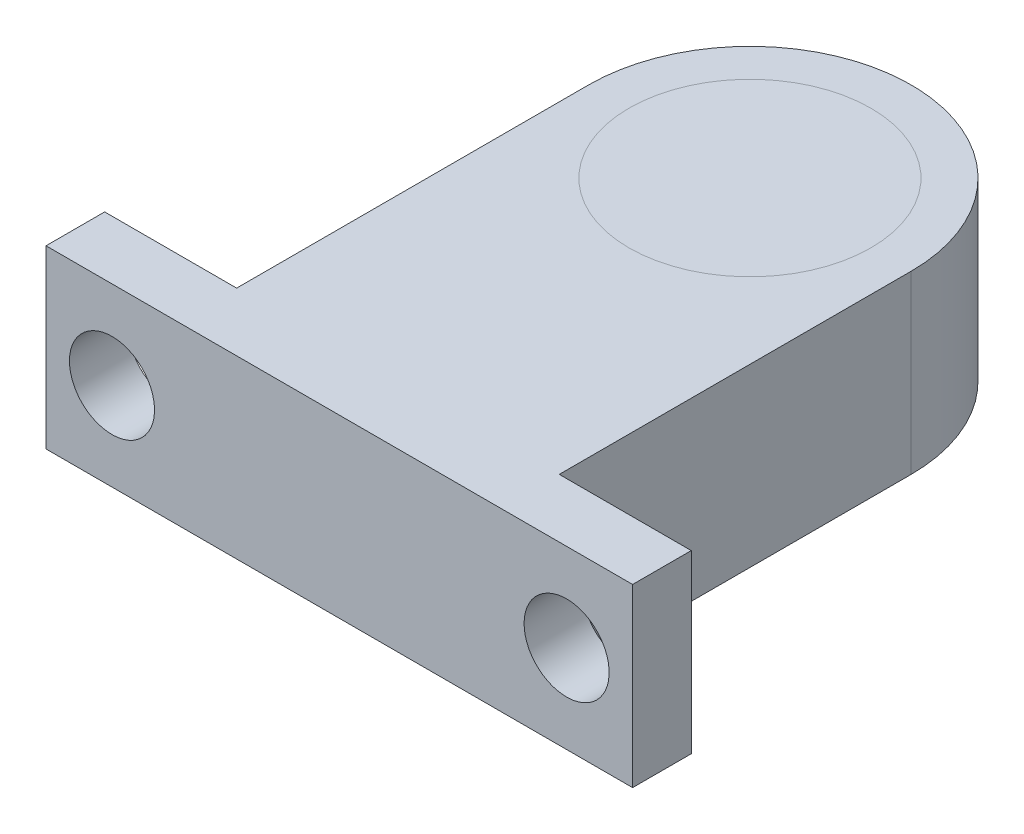
ISO-10303-21;
HEADER;
FILE_DESCRIPTION(('STEP AP214'),'2;1');
FILE_NAME('part.step','',(''),(''),'','','');
FILE_SCHEMA(('AUTOMOTIVE_DESIGN { 1 0 10303 214 1 1 1 1 }'));
ENDSEC;
DATA;
#1=APPLICATION_CONTEXT('core data for automotive mechanical design processes');
#2=APPLICATION_PROTOCOL_DEFINITION('international standard','automotive_design',2000,#1);
#3=PRODUCT_CONTEXT('',#1,'mechanical');
#4=PRODUCT('Part','Part','',(#3));
#5=PRODUCT_RELATED_PRODUCT_CATEGORY('part','',(#4));
#6=PRODUCT_DEFINITION_FORMATION('','',#4);
#7=PRODUCT_DEFINITION_CONTEXT('part definition',#1,'design');
#8=PRODUCT_DEFINITION('design','',#6,#7);
#9=PRODUCT_DEFINITION_SHAPE('','',#8);
#10=(LENGTH_UNIT() NAMED_UNIT(*) SI_UNIT(.MILLI.,.METRE.));
#11=(NAMED_UNIT(*) PLANE_ANGLE_UNIT() SI_UNIT($,.RADIAN.));
#12=(NAMED_UNIT(*) SI_UNIT($,.STERADIAN.) SOLID_ANGLE_UNIT());
#13=UNCERTAINTY_MEASURE_WITH_UNIT(LENGTH_MEASURE(1.E-05),#10,'distance_accuracy_value','');
#14=(GEOMETRIC_REPRESENTATION_CONTEXT(3) GLOBAL_UNCERTAINTY_ASSIGNED_CONTEXT((#13)) GLOBAL_UNIT_ASSIGNED_CONTEXT((#10,
#11,#12)) REPRESENTATION_CONTEXT('',''));
#15=CARTESIAN_POINT('',(0.,0.,0.));
#16=DIRECTION('',(0.,0.,1.));
#17=DIRECTION('',(1.,0.,0.));
#18=AXIS2_PLACEMENT_3D('',#15,#16,#17);
#19=CARTESIAN_POINT('',(0.,5.5,0.));
#20=DIRECTION('',(0.,1.,0.));
#21=DIRECTION('',(0.,0.,1.));
#22=AXIS2_PLACEMENT_3D('',#19,#20,#21);
#23=CYLINDRICAL_SURFACE('',#22,4.12499999999999);
#24=CARTESIAN_POINT('',(0.,5.5,0.));
#25=DIRECTION('',(0.,1.,0.));
#26=DIRECTION('',(0.,0.,1.));
#27=AXIS2_PLACEMENT_3D('',#24,#25,#26);
#28=CIRCLE('',#27,4.12499999999999);
#29=CARTESIAN_POINT('',(0.,5.5,4.12499999999999));
#30=VERTEX_POINT('',#29);
#31=EDGE_CURVE('E11',#30,#30,#28,.T.);
#32=ORIENTED_EDGE('',*,*,#31,.T.);
#33=EDGE_LOOP('',(#32));
#34=FACE_BOUND('',#33,.T.);
#35=CARTESIAN_POINT('',(0.,6.,0.));
#36=DIRECTION('',(0.,1.,0.));
#37=DIRECTION('',(0.,0.,1.));
#38=AXIS2_PLACEMENT_3D('',#35,#36,#37);
#39=CIRCLE('',#38,4.12499999999999);
#40=CARTESIAN_POINT('',(0.,6.,4.12499999999999));
#41=VERTEX_POINT('',#40);
#42=EDGE_CURVE('E58',#41,#41,#39,.T.);
#43=ORIENTED_EDGE('',*,*,#42,.F.);
#44=EDGE_LOOP('',(#43));
#45=FACE_BOUND('',#44,.T.);
#46=ADVANCED_FACE('F55',(#34,#45),#23,.T.);
#47=CARTESIAN_POINT('',(0.,5.5,0.));
#48=DIRECTION('',(0.,1.,0.));
#49=DIRECTION('',(0.,0.,1.));
#50=AXIS2_PLACEMENT_3D('',#47,#48,#49);
#51=PLANE('',#50);
#52=ORIENTED_EDGE('',*,*,#31,.F.);
#53=EDGE_LOOP('',(#52));
#54=FACE_BOUND('',#53,.T.);
#55=ADVANCED_FACE('F70',(#54),#51,.F.);
#56=CARTESIAN_POINT('',(0.,6.,0.));
#57=DIRECTION('',(0.,1.,0.));
#58=DIRECTION('',(0.,0.,1.));
#59=AXIS2_PLACEMENT_3D('',#56,#57,#58);
#60=PLANE('',#59);
#61=ORIENTED_EDGE('',*,*,#42,.T.);
#62=EDGE_LOOP('',(#61));
#63=FACE_BOUND('',#62,.T.);
#64=ADVANCED_FACE('F67',(#63),#60,.T.);
#65=CLOSED_SHELL('',(#46,#55,#64));
#66=MANIFOLD_SOLID_BREP('B2',#65);
#67=CARTESIAN_POINT('',(5.5,6.,0.));
#68=DIRECTION('',(1.,0.,0.));
#69=DIRECTION('',(0.,0.,-1.));
#70=AXIS2_PLACEMENT_3D('',#67,#68,#69);
#71=PLANE('',#70);
#72=DIRECTION('',(0.,0.,1.));
#73=VECTOR('',#72,1.);
#74=CARTESIAN_POINT('',(5.5,0.,0.));
#75=LINE('',#74,#73);
#76=CARTESIAN_POINT('',(5.5,0.,0.));
#77=VERTEX_POINT('',#76);
#78=CARTESIAN_POINT('',(5.5,0.,12.));
#79=VERTEX_POINT('',#78);
#80=EDGE_CURVE('E198',#77,#79,#75,.T.);
#81=ORIENTED_EDGE('',*,*,#80,.F.);
#82=DIRECTION('',(0.,-1.,0.));
#83=VECTOR('',#82,1.);
#84=CARTESIAN_POINT('',(5.5,6.,0.));
#85=LINE('',#84,#83);
#86=CARTESIAN_POINT('',(5.5,6.,0.));
#87=VERTEX_POINT('',#86);
#88=EDGE_CURVE('E53',#87,#77,#85,.T.);
#89=ORIENTED_EDGE('',*,*,#88,.F.);
#90=DIRECTION('',(0.,0.,1.));
#91=VECTOR('',#90,1.);
#92=CARTESIAN_POINT('',(5.5,6.,0.));
#93=LINE('',#92,#91);
#94=CARTESIAN_POINT('',(5.5,6.,12.));
#95=VERTEX_POINT('',#94);
#96=EDGE_CURVE('E114',#87,#95,#93,.T.);
#97=ORIENTED_EDGE('',*,*,#96,.T.);
#98=DIRECTION('',(0.,-1.,0.));
#99=VECTOR('',#98,1.);
#100=CARTESIAN_POINT('',(5.5,6.,12.));
#101=LINE('',#100,#99);
#102=EDGE_CURVE('E133',#95,#79,#101,.T.);
#103=ORIENTED_EDGE('',*,*,#102,.T.);
#104=EDGE_LOOP('',(#81,#89,#97,#103));
#105=FACE_BOUND('',#104,.T.);
#106=ADVANCED_FACE('F96',(#105),#71,.T.);
#107=CARTESIAN_POINT('',(0.,6.,0.));
#108=DIRECTION('',(0.,-1.,0.));
#109=DIRECTION('',(0.,0.,-1.));
#110=AXIS2_PLACEMENT_3D('',#107,#108,#109);
#111=CYLINDRICAL_SURFACE('',#110,5.5);
#112=CARTESIAN_POINT('',(0.,0.,0.));
#113=DIRECTION('',(0.,1.,0.));
#114=DIRECTION('',(0.,0.,1.));
#115=AXIS2_PLACEMENT_3D('',#112,#113,#114);
#116=CIRCLE('',#115,5.5);
#117=CARTESIAN_POINT('',(-5.5,0.,0.));
#118=VERTEX_POINT('',#117);
#119=EDGE_CURVE('E219',#77,#118,#116,.T.);
#120=ORIENTED_EDGE('',*,*,#119,.T.);
#121=DIRECTION('',(0.,-1.,0.));
#122=VECTOR('',#121,1.);
#123=CARTESIAN_POINT('',(-5.5,6.,0.));
#124=LINE('',#123,#122);
#125=CARTESIAN_POINT('',(-5.5,6.,0.));
#126=VERTEX_POINT('',#125);
#127=EDGE_CURVE('E106',#126,#118,#124,.T.);
#128=ORIENTED_EDGE('',*,*,#127,.F.);
#129=CARTESIAN_POINT('',(0.,6.,0.));
#130=DIRECTION('',(0.,1.,0.));
#131=DIRECTION('',(0.,0.,1.));
#132=AXIS2_PLACEMENT_3D('',#129,#130,#131);
#133=CIRCLE('',#132,5.5);
#134=EDGE_CURVE('E210',#87,#126,#133,.T.);
#135=ORIENTED_EDGE('',*,*,#134,.F.);
#136=ORIENTED_EDGE('',*,*,#88,.T.);
#137=EDGE_LOOP('',(#120,#128,#135,#136));
#138=FACE_BOUND('',#137,.T.);
#139=ADVANCED_FACE('F236',(#138),#111,.T.);
#140=CARTESIAN_POINT('',(-5.5,6.,0.));
#141=DIRECTION('',(1.,0.,0.));
#142=DIRECTION('',(0.,0.,-1.));
#143=AXIS2_PLACEMENT_3D('',#140,#141,#142);
#144=PLANE('',#143);
#145=DIRECTION('',(0.,0.,1.));
#146=VECTOR('',#145,1.);
#147=CARTESIAN_POINT('',(-5.5,0.,0.));
#148=LINE('',#147,#146);
#149=CARTESIAN_POINT('',(-5.5,0.,12.));
#150=VERTEX_POINT('',#149);
#151=EDGE_CURVE('E129',#118,#150,#148,.T.);
#152=ORIENTED_EDGE('',*,*,#151,.T.);
#153=DIRECTION('',(0.,-1.,0.));
#154=VECTOR('',#153,1.);
#155=CARTESIAN_POINT('',(-5.5,6.,12.));
#156=LINE('',#155,#154);
#157=CARTESIAN_POINT('',(-5.5,6.,12.));
#158=VERTEX_POINT('',#157);
#159=EDGE_CURVE('E227',#158,#150,#156,.T.);
#160=ORIENTED_EDGE('',*,*,#159,.F.);
#161=DIRECTION('',(0.,0.,1.));
#162=VECTOR('',#161,1.);
#163=CARTESIAN_POINT('',(-5.5,6.,0.));
#164=LINE('',#163,#162);
#165=EDGE_CURVE('E214',#126,#158,#164,.T.);
#166=ORIENTED_EDGE('',*,*,#165,.F.);
#167=ORIENTED_EDGE('',*,*,#127,.T.);
#168=EDGE_LOOP('',(#152,#160,#166,#167));
#169=FACE_BOUND('',#168,.T.);
#170=ADVANCED_FACE('F233',(#169),#144,.F.);
#171=CARTESIAN_POINT('',(0.,6.,0.));
#172=DIRECTION('',(0.,-1.,0.));
#173=DIRECTION('',(0.,0.,-1.));
#174=AXIS2_PLACEMENT_3D('',#171,#172,#173);
#175=CYLINDRICAL_SURFACE('',#174,4.12499999999999);
#176=CARTESIAN_POINT('',(0.,6.,0.));
#177=DIRECTION('',(0.,1.,0.));
#178=DIRECTION('',(0.,0.,1.));
#179=AXIS2_PLACEMENT_3D('',#176,#177,#178);
#180=CIRCLE('',#179,4.12499999999999);
#181=CARTESIAN_POINT('',(0.,6.,4.12499999999999));
#182=VERTEX_POINT('',#181);
#183=EDGE_CURVE('E204',#182,#182,#180,.T.);
#184=ORIENTED_EDGE('',*,*,#183,.T.);
#185=EDGE_LOOP('',(#184));
#186=FACE_BOUND('',#185,.T.);
#187=CARTESIAN_POINT('',(0.,0.,0.));
#188=DIRECTION('',(0.,1.,0.));
#189=DIRECTION('',(0.,0.,1.));
#190=AXIS2_PLACEMENT_3D('',#187,#188,#189);
#191=CIRCLE('',#190,4.12499999999999);
#192=CARTESIAN_POINT('',(0.,0.,4.12499999999999));
#193=VERTEX_POINT('',#192);
#194=EDGE_CURVE('E193',#193,#193,#191,.T.);
#195=ORIENTED_EDGE('',*,*,#194,.F.);
#196=EDGE_LOOP('',(#195));
#197=FACE_BOUND('',#196,.T.);
#198=ADVANCED_FACE('F98',(#186,#197),#175,.F.);
#199=CARTESIAN_POINT('',(0.,6.,0.));
#200=DIRECTION('',(0.,1.,0.));
#201=DIRECTION('',(0.,0.,1.));
#202=AXIS2_PLACEMENT_3D('',#199,#200,#201);
#203=PLANE('',#202);
#204=ORIENTED_EDGE('',*,*,#183,.F.);
#205=EDGE_LOOP('',(#204));
#206=FACE_BOUND('',#205,.T.);
#207=ORIENTED_EDGE('',*,*,#96,.F.);
#208=ORIENTED_EDGE('',*,*,#134,.T.);
#209=ORIENTED_EDGE('',*,*,#165,.T.);
#210=DIRECTION('',(-1.,0.,0.));
#211=VECTOR('',#210,1.);
#212=CARTESIAN_POINT('',(-10.,6.,12.));
#213=LINE('',#212,#211);
#214=CARTESIAN_POINT('',(-10.,6.,12.));
#215=VERTEX_POINT('',#214);
#216=EDGE_CURVE('E311',#158,#215,#213,.T.);
#217=ORIENTED_EDGE('',*,*,#216,.T.);
#218=DIRECTION('',(0.,0.,-1.));
#219=VECTOR('',#218,1.);
#220=CARTESIAN_POINT('',(-10.,6.,14.));
#221=LINE('',#220,#219);
#222=CARTESIAN_POINT('',(-10.,6.,14.));
#223=VERTEX_POINT('',#222);
#224=EDGE_CURVE('E301',#223,#215,#221,.T.);
#225=ORIENTED_EDGE('',*,*,#224,.F.);
#226=DIRECTION('',(-1.,0.,0.));
#227=VECTOR('',#226,1.);
#228=CARTESIAN_POINT('',(-10.,6.,14.));
#229=LINE('',#228,#227);
#230=CARTESIAN_POINT('',(10.,6.,14.));
#231=VERTEX_POINT('',#230);
#232=EDGE_CURVE('E182',#231,#223,#229,.T.);
#233=ORIENTED_EDGE('',*,*,#232,.F.);
#234=DIRECTION('',(0.,0.,-1.));
#235=VECTOR('',#234,1.);
#236=CARTESIAN_POINT('',(10.,6.,14.));
#237=LINE('',#236,#235);
#238=CARTESIAN_POINT('',(10.,6.,12.));
#239=VERTEX_POINT('',#238);
#240=EDGE_CURVE('E200',#231,#239,#237,.T.);
#241=ORIENTED_EDGE('',*,*,#240,.T.);
#242=EDGE_CURVE('E187',#239,#95,#213,.T.);
#243=ORIENTED_EDGE('',*,*,#242,.T.);
#244=EDGE_LOOP('',(#207,#208,#209,#217,#225,#233,#241,#243));
#245=FACE_BOUND('',#244,.T.);
#246=ADVANCED_FACE('F250',(#206,#245),#203,.T.);
#247=CARTESIAN_POINT('',(0.,0.,0.));
#248=DIRECTION('',(0.,1.,0.));
#249=DIRECTION('',(0.,0.,1.));
#250=AXIS2_PLACEMENT_3D('',#247,#248,#249);
#251=PLANE('',#250);
#252=ORIENTED_EDGE('',*,*,#194,.T.);
#253=EDGE_LOOP('',(#252));
#254=FACE_BOUND('',#253,.T.);
#255=ORIENTED_EDGE('',*,*,#80,.T.);
#256=DIRECTION('',(1.,0.,0.));
#257=VECTOR('',#256,1.);
#258=CARTESIAN_POINT('',(-10.,0.,12.));
#259=LINE('',#258,#257);
#260=CARTESIAN_POINT('',(10.,0.,12.));
#261=VERTEX_POINT('',#260);
#262=EDGE_CURVE('E304',#79,#261,#259,.T.);
#263=ORIENTED_EDGE('',*,*,#262,.T.);
#264=DIRECTION('',(0.,0.,-1.));
#265=VECTOR('',#264,1.);
#266=CARTESIAN_POINT('',(10.,0.,14.));
#267=LINE('',#266,#265);
#268=CARTESIAN_POINT('',(10.,0.,14.));
#269=VERTEX_POINT('',#268);
#270=EDGE_CURVE('E172',#269,#261,#267,.T.);
#271=ORIENTED_EDGE('',*,*,#270,.F.);
#272=DIRECTION('',(1.,0.,0.));
#273=VECTOR('',#272,1.);
#274=CARTESIAN_POINT('',(-10.,0.,14.));
#275=LINE('',#274,#273);
#276=CARTESIAN_POINT('',(-10.,0.,14.));
#277=VERTEX_POINT('',#276);
#278=EDGE_CURVE('E165',#277,#269,#275,.T.);
#279=ORIENTED_EDGE('',*,*,#278,.F.);
#280=DIRECTION('',(0.,0.,-1.));
#281=VECTOR('',#280,1.);
#282=CARTESIAN_POINT('',(-10.,0.,14.));
#283=LINE('',#282,#281);
#284=CARTESIAN_POINT('',(-10.,0.,12.));
#285=VERTEX_POINT('',#284);
#286=EDGE_CURVE('E169',#277,#285,#283,.T.);
#287=ORIENTED_EDGE('',*,*,#286,.T.);
#288=EDGE_CURVE('E305',#285,#150,#259,.T.);
#289=ORIENTED_EDGE('',*,*,#288,.T.);
#290=ORIENTED_EDGE('',*,*,#151,.F.);
#291=ORIENTED_EDGE('',*,*,#119,.F.);
#292=EDGE_LOOP('',(#255,#263,#271,#279,#287,#289,#290,#291));
#293=FACE_BOUND('',#292,.T.);
#294=ADVANCED_FACE('F167',(#254,#293),#251,.F.);
#295=CARTESIAN_POINT('',(0.,0.,12.));
#296=DIRECTION('',(0.,0.,1.));
#297=DIRECTION('',(1.,0.,0.));
#298=AXIS2_PLACEMENT_3D('',#295,#296,#297);
#299=PLANE('',#298);
#300=CARTESIAN_POINT('',(-7.75,3.,12.));
#301=DIRECTION('',(0.,0.,-1.));
#302=DIRECTION('',(-1.,0.,0.));
#303=AXIS2_PLACEMENT_3D('',#300,#301,#302);
#304=CIRCLE('',#303,1.45);
#305=CARTESIAN_POINT('',(-9.2,3.,12.));
#306=VERTEX_POINT('',#305);
#307=EDGE_CURVE('E287',#306,#306,#304,.T.);
#308=ORIENTED_EDGE('',*,*,#307,.F.);
#309=EDGE_LOOP('',(#308));
#310=FACE_BOUND('',#309,.T.);
#311=ORIENTED_EDGE('',*,*,#216,.F.);
#312=ORIENTED_EDGE('',*,*,#159,.T.);
#313=ORIENTED_EDGE('',*,*,#288,.F.);
#314=DIRECTION('',(0.,-1.,0.));
#315=VECTOR('',#314,1.);
#316=CARTESIAN_POINT('',(-10.,6.,12.));
#317=LINE('',#316,#315);
#318=EDGE_CURVE('E191',#215,#285,#317,.T.);
#319=ORIENTED_EDGE('',*,*,#318,.F.);
#320=EDGE_LOOP('',(#311,#312,#313,#319));
#321=FACE_BOUND('',#320,.T.);
#322=ADVANCED_FACE('F249',(#310,#321),#299,.F.);
#323=CARTESIAN_POINT('',(-10.,6.,14.));
#324=DIRECTION('',(1.,0.,0.));
#325=DIRECTION('',(0.,0.,-1.));
#326=AXIS2_PLACEMENT_3D('',#323,#324,#325);
#327=PLANE('',#326);
#328=ORIENTED_EDGE('',*,*,#318,.T.);
#329=ORIENTED_EDGE('',*,*,#286,.F.);
#330=DIRECTION('',(0.,-1.,0.));
#331=VECTOR('',#330,1.);
#332=CARTESIAN_POINT('',(-10.,6.,14.));
#333=LINE('',#332,#331);
#334=EDGE_CURVE('E177',#223,#277,#333,.T.);
#335=ORIENTED_EDGE('',*,*,#334,.F.);
#336=ORIENTED_EDGE('',*,*,#224,.T.);
#337=EDGE_LOOP('',(#328,#329,#335,#336));
#338=FACE_BOUND('',#337,.T.);
#339=ADVANCED_FACE('F189',(#338),#327,.F.);
#340=CARTESIAN_POINT('',(10.,6.,14.));
#341=DIRECTION('',(-1.,0.,0.));
#342=DIRECTION('',(0.,0.,1.));
#343=AXIS2_PLACEMENT_3D('',#340,#341,#342);
#344=PLANE('',#343);
#345=DIRECTION('',(0.,1.,0.));
#346=VECTOR('',#345,1.);
#347=CARTESIAN_POINT('',(10.,6.,12.));
#348=LINE('',#347,#346);
#349=EDGE_CURVE('E308',#261,#239,#348,.T.);
#350=ORIENTED_EDGE('',*,*,#349,.T.);
#351=ORIENTED_EDGE('',*,*,#240,.F.);
#352=DIRECTION('',(0.,1.,0.));
#353=VECTOR('',#352,1.);
#354=CARTESIAN_POINT('',(10.,6.,14.));
#355=LINE('',#354,#353);
#356=EDGE_CURVE('E176',#269,#231,#355,.T.);
#357=ORIENTED_EDGE('',*,*,#356,.F.);
#358=ORIENTED_EDGE('',*,*,#270,.T.);
#359=EDGE_LOOP('',(#350,#351,#357,#358));
#360=FACE_BOUND('',#359,.T.);
#361=ADVANCED_FACE('F257',(#360),#344,.F.);
#362=CARTESIAN_POINT('',(0.,0.,14.));
#363=DIRECTION('',(0.,0.,1.));
#364=DIRECTION('',(1.,0.,0.));
#365=AXIS2_PLACEMENT_3D('',#362,#363,#364);
#366=PLANE('',#365);
#367=CARTESIAN_POINT('',(7.75,3.,14.));
#368=DIRECTION('',(0.,0.,-1.));
#369=DIRECTION('',(-1.,0.,0.));
#370=AXIS2_PLACEMENT_3D('',#367,#368,#369);
#371=CIRCLE('',#370,1.45);
#372=CARTESIAN_POINT('',(6.3,3.,14.));
#373=VERTEX_POINT('',#372);
#374=EDGE_CURVE('E280',#373,#373,#371,.T.);
#375=ORIENTED_EDGE('',*,*,#374,.T.);
#376=EDGE_LOOP('',(#375));
#377=FACE_BOUND('',#376,.T.);
#378=CARTESIAN_POINT('',(-7.75,3.,14.));
#379=DIRECTION('',(0.,0.,-1.));
#380=DIRECTION('',(-1.,0.,0.));
#381=AXIS2_PLACEMENT_3D('',#378,#379,#380);
#382=CIRCLE('',#381,1.45);
#383=CARTESIAN_POINT('',(-9.2,3.,14.));
#384=VERTEX_POINT('',#383);
#385=EDGE_CURVE('E293',#384,#384,#382,.T.);
#386=ORIENTED_EDGE('',*,*,#385,.T.);
#387=EDGE_LOOP('',(#386));
#388=FACE_BOUND('',#387,.T.);
#389=ORIENTED_EDGE('',*,*,#334,.T.);
#390=ORIENTED_EDGE('',*,*,#278,.T.);
#391=ORIENTED_EDGE('',*,*,#356,.T.);
#392=ORIENTED_EDGE('',*,*,#232,.T.);
#393=EDGE_LOOP('',(#389,#390,#391,#392));
#394=FACE_BOUND('',#393,.T.);
#395=ADVANCED_FACE('F180',(#377,#388,#394),#366,.T.);
#396=CARTESIAN_POINT('',(7.75,3.,12.));
#397=DIRECTION('',(0.,0.,-1.));
#398=DIRECTION('',(-1.,0.,0.));
#399=AXIS2_PLACEMENT_3D('',#396,#397,#398);
#400=CIRCLE('',#399,1.45);
#401=CARTESIAN_POINT('',(6.3,3.,12.));
#402=VERTEX_POINT('',#401);
#403=EDGE_CURVE('E283',#402,#402,#400,.T.);
#404=ORIENTED_EDGE('',*,*,#403,.F.);
#405=EDGE_LOOP('',(#404));
#406=FACE_BOUND('',#405,.T.);
#407=ORIENTED_EDGE('',*,*,#102,.F.);
#408=ORIENTED_EDGE('',*,*,#242,.F.);
#409=ORIENTED_EDGE('',*,*,#349,.F.);
#410=ORIENTED_EDGE('',*,*,#262,.F.);
#411=EDGE_LOOP('',(#407,#408,#409,#410));
#412=FACE_BOUND('',#411,.T.);
#413=ADVANCED_FACE('F261',(#406,#412),#299,.F.);
#414=CARTESIAN_POINT('',(-7.75,3.,12.));
#415=DIRECTION('',(0.,0.,-1.));
#416=DIRECTION('',(-1.,0.,0.));
#417=AXIS2_PLACEMENT_3D('',#414,#415,#416);
#418=CYLINDRICAL_SURFACE('',#417,1.45);
#419=ORIENTED_EDGE('',*,*,#385,.F.);
#420=EDGE_LOOP('',(#419));
#421=FACE_BOUND('',#420,.T.);
#422=ORIENTED_EDGE('',*,*,#307,.T.);
#423=EDGE_LOOP('',(#422));
#424=FACE_BOUND('',#423,.T.);
#425=ADVANCED_FACE('F264',(#421,#424),#418,.F.);
#426=CARTESIAN_POINT('',(7.75,3.,12.));
#427=DIRECTION('',(0.,0.,-1.));
#428=DIRECTION('',(-1.,0.,0.));
#429=AXIS2_PLACEMENT_3D('',#426,#427,#428);
#430=CYLINDRICAL_SURFACE('',#429,1.45);
#431=ORIENTED_EDGE('',*,*,#374,.F.);
#432=EDGE_LOOP('',(#431));
#433=FACE_BOUND('',#432,.T.);
#434=ORIENTED_EDGE('',*,*,#403,.T.);
#435=EDGE_LOOP('',(#434));
#436=FACE_BOUND('',#435,.T.);
#437=ADVANCED_FACE('F271',(#433,#436),#430,.F.);
#438=CLOSED_SHELL('',(#106,#139,#170,#198,#246,#294,#322,#339,#361,#395,#413,#425,#437));
#439=MANIFOLD_SOLID_BREP('B6',#438);
#440=ADVANCED_BREP_SHAPE_REPRESENTATION('',(#18,#66,#439),#14);
#441=SHAPE_DEFINITION_REPRESENTATION(#9,#440);
ENDSEC;
END-ISO-10303-21;
